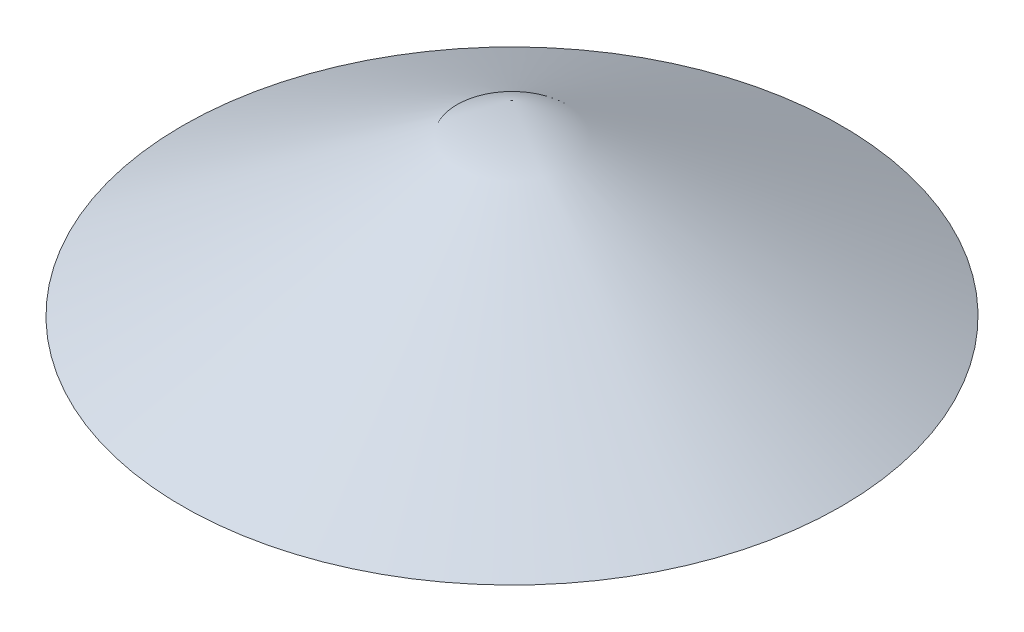
ISO-10303-21;
HEADER;
FILE_DESCRIPTION(('STEP AP214'),'2;1');
FILE_NAME('part.step','',(''),(''),'','','');
FILE_SCHEMA(('AUTOMOTIVE_DESIGN { 1 0 10303 214 1 1 1 1 }'));
ENDSEC;
DATA;
#1=APPLICATION_CONTEXT('core data for automotive mechanical design processes');
#2=APPLICATION_PROTOCOL_DEFINITION('international standard','automotive_design',2000,#1);
#3=PRODUCT_CONTEXT('',#1,'mechanical');
#4=PRODUCT('Part','Part','',(#3));
#5=PRODUCT_RELATED_PRODUCT_CATEGORY('part','',(#4));
#6=PRODUCT_DEFINITION_FORMATION('','',#4);
#7=PRODUCT_DEFINITION_CONTEXT('part definition',#1,'design');
#8=PRODUCT_DEFINITION('design','',#6,#7);
#9=PRODUCT_DEFINITION_SHAPE('','',#8);
#10=(LENGTH_UNIT() NAMED_UNIT(*) SI_UNIT(.MILLI.,.METRE.));
#11=(NAMED_UNIT(*) PLANE_ANGLE_UNIT() SI_UNIT($,.RADIAN.));
#12=(NAMED_UNIT(*) SI_UNIT($,.STERADIAN.) SOLID_ANGLE_UNIT());
#13=UNCERTAINTY_MEASURE_WITH_UNIT(LENGTH_MEASURE(1.E-05),#10,'distance_accuracy_value','');
#14=(GEOMETRIC_REPRESENTATION_CONTEXT(3) GLOBAL_UNCERTAINTY_ASSIGNED_CONTEXT((#13)) GLOBAL_UNIT_ASSIGNED_CONTEXT((#10,
#11,#12)) REPRESENTATION_CONTEXT('',''));
#15=CARTESIAN_POINT('',(0.,0.,0.));
#16=DIRECTION('',(0.,0.,1.));
#17=DIRECTION('',(1.,0.,0.));
#18=AXIS2_PLACEMENT_3D('',#15,#16,#17);
#19=CARTESIAN_POINT('',(0.,0.,0.));
#20=DIRECTION('',(0.,1.,0.));
#21=DIRECTION('',(-1.,0.,0.));
#22=AXIS2_PLACEMENT_3D('',#19,#20,#21);
#23=PLANE('',#22);
#24=CARTESIAN_POINT('',(0.,0.,0.));
#25=DIRECTION('',(0.,1.,0.));
#26=DIRECTION('',(-1.,0.,0.));
#27=AXIS2_PLACEMENT_3D('',#24,#25,#26);
#28=CIRCLE('',#27,30.);
#29=CARTESIAN_POINT('',(-30.,0.,0.));
#30=VERTEX_POINT('',#29);
#31=EDGE_CURVE('E11',#30,#30,#28,.T.);
#32=ORIENTED_EDGE('',*,*,#31,.F.);
#33=EDGE_LOOP('',(#32));
#34=FACE_BOUND('',#33,.T.);
#35=ADVANCED_FACE('F37',(#34),#23,.F.);
#36=CARTESIAN_POINT('',(0.,0.,0.));
#37=DIRECTION('',(0.,-1.,0.));
#38=DIRECTION('',(1.,0.,0.));
#39=AXIS2_PLACEMENT_3D('',#36,#37,#38);
#40=CONICAL_SURFACE('',#39,30.,1.05524731933592);
#41=CARTESIAN_POINT('',(0.,17.,0.));
#42=VERTEX_POINT('',#41);
#43=VERTEX_LOOP('',#42);
#44=FACE_BOUND('',#43,.T.);
#45=ORIENTED_EDGE('',*,*,#31,.T.);
#46=EDGE_LOOP('',(#45));
#47=FACE_BOUND('',#46,.T.);
#48=ADVANCED_FACE('F44',(#44,#47),#40,.T.);
#49=CLOSED_SHELL('',(#35,#48));
#50=MANIFOLD_SOLID_BREP('B2',#49);
#51=ADVANCED_BREP_SHAPE_REPRESENTATION('',(#18,#50),#14);
#52=SHAPE_DEFINITION_REPRESENTATION(#9,#51);
ENDSEC;
END-ISO-10303-21;
